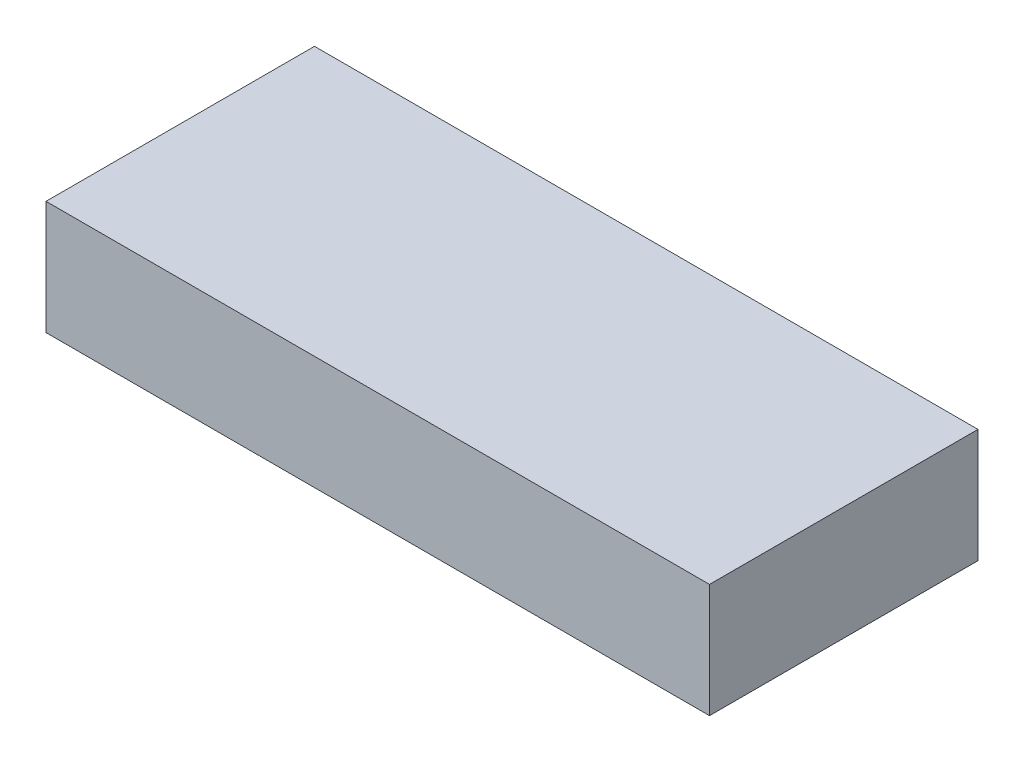
ISO-10303-21;
HEADER;
FILE_DESCRIPTION(('STEP AP214'),'2;1');
FILE_NAME('part.step','',(''),(''),'','','');
FILE_SCHEMA(('AUTOMOTIVE_DESIGN { 1 0 10303 214 1 1 1 1 }'));
ENDSEC;
DATA;
#1=APPLICATION_CONTEXT('core data for automotive mechanical design processes');
#2=APPLICATION_PROTOCOL_DEFINITION('international standard','automotive_design',2000,#1);
#3=PRODUCT_CONTEXT('',#1,'mechanical');
#4=PRODUCT('Part','Part','',(#3));
#5=PRODUCT_RELATED_PRODUCT_CATEGORY('part','',(#4));
#6=PRODUCT_DEFINITION_FORMATION('','',#4);
#7=PRODUCT_DEFINITION_CONTEXT('part definition',#1,'design');
#8=PRODUCT_DEFINITION('design','',#6,#7);
#9=PRODUCT_DEFINITION_SHAPE('','',#8);
#10=(LENGTH_UNIT() NAMED_UNIT(*) SI_UNIT(.MILLI.,.METRE.));
#11=(NAMED_UNIT(*) PLANE_ANGLE_UNIT() SI_UNIT($,.RADIAN.));
#12=(NAMED_UNIT(*) SI_UNIT($,.STERADIAN.) SOLID_ANGLE_UNIT());
#13=UNCERTAINTY_MEASURE_WITH_UNIT(LENGTH_MEASURE(1.E-05),#10,'distance_accuracy_value','');
#14=(GEOMETRIC_REPRESENTATION_CONTEXT(3) GLOBAL_UNCERTAINTY_ASSIGNED_CONTEXT((#13)) GLOBAL_UNIT_ASSIGNED_CONTEXT((#10,
#11,#12)) REPRESENTATION_CONTEXT('',''));
#15=CARTESIAN_POINT('',(0.,0.,0.));
#16=DIRECTION('',(0.,0.,1.));
#17=DIRECTION('',(1.,0.,0.));
#18=AXIS2_PLACEMENT_3D('',#15,#16,#17);
#19=CARTESIAN_POINT('',(-31.075,10.65,12.575));
#20=DIRECTION('',(1.,0.,0.));
#21=DIRECTION('',(0.,0.,-1.));
#22=AXIS2_PLACEMENT_3D('',#19,#20,#21);
#23=PLANE('',#22);
#24=DIRECTION('',(0.,0.,1.));
#25=VECTOR('',#24,1.);
#26=CARTESIAN_POINT('',(-31.075,0.,12.575));
#27=LINE('',#26,#25);
#28=CARTESIAN_POINT('',(-31.075,0.,-12.575));
#29=VERTEX_POINT('',#28);
#30=CARTESIAN_POINT('',(-31.075,0.,12.575));
#31=VERTEX_POINT('',#30);
#32=EDGE_CURVE('E96',#29,#31,#27,.T.);
#33=ORIENTED_EDGE('',*,*,#32,.T.);
#34=DIRECTION('',(0.,-1.,0.));
#35=VECTOR('',#34,1.);
#36=CARTESIAN_POINT('',(-31.075,10.65,12.575));
#37=LINE('',#36,#35);
#38=CARTESIAN_POINT('',(-31.075,10.65,12.575));
#39=VERTEX_POINT('',#38);
#40=EDGE_CURVE('E11',#39,#31,#37,.T.);
#41=ORIENTED_EDGE('',*,*,#40,.F.);
#42=DIRECTION('',(0.,0.,1.));
#43=VECTOR('',#42,1.);
#44=CARTESIAN_POINT('',(-31.075,10.65,12.575));
#45=LINE('',#44,#43);
#46=CARTESIAN_POINT('',(-31.075,10.65,-12.575));
#47=VERTEX_POINT('',#46);
#48=EDGE_CURVE('E84',#47,#39,#45,.T.);
#49=ORIENTED_EDGE('',*,*,#48,.F.);
#50=DIRECTION('',(0.,-1.,0.));
#51=VECTOR('',#50,1.);
#52=CARTESIAN_POINT('',(-31.075,10.65,-12.575));
#53=LINE('',#52,#51);
#54=EDGE_CURVE('E92',#47,#29,#53,.T.);
#55=ORIENTED_EDGE('',*,*,#54,.T.);
#56=EDGE_LOOP('',(#33,#41,#49,#55));
#57=FACE_BOUND('',#56,.T.);
#58=ADVANCED_FACE('F33',(#57),#23,.F.);
#59=CARTESIAN_POINT('',(31.075,10.65,12.575));
#60=DIRECTION('',(0.,0.,-1.));
#61=DIRECTION('',(-1.,0.,0.));
#62=AXIS2_PLACEMENT_3D('',#59,#60,#61);
#63=PLANE('',#62);
#64=DIRECTION('',(1.,0.,0.));
#65=VECTOR('',#64,1.);
#66=CARTESIAN_POINT('',(31.075,0.,12.575));
#67=LINE('',#66,#65);
#68=CARTESIAN_POINT('',(31.075,0.,12.575));
#69=VERTEX_POINT('',#68);
#70=EDGE_CURVE('E88',#31,#69,#67,.T.);
#71=ORIENTED_EDGE('',*,*,#70,.T.);
#72=DIRECTION('',(0.,-1.,0.));
#73=VECTOR('',#72,1.);
#74=CARTESIAN_POINT('',(31.075,10.65,12.575));
#75=LINE('',#74,#73);
#76=CARTESIAN_POINT('',(31.075,10.65,12.575));
#77=VERTEX_POINT('',#76);
#78=EDGE_CURVE('E41',#77,#69,#75,.T.);
#79=ORIENTED_EDGE('',*,*,#78,.F.);
#80=DIRECTION('',(1.,0.,0.));
#81=VECTOR('',#80,1.);
#82=CARTESIAN_POINT('',(31.075,10.65,12.575));
#83=LINE('',#82,#81);
#84=EDGE_CURVE('E79',#39,#77,#83,.T.);
#85=ORIENTED_EDGE('',*,*,#84,.F.);
#86=ORIENTED_EDGE('',*,*,#40,.T.);
#87=EDGE_LOOP('',(#71,#79,#85,#86));
#88=FACE_BOUND('',#87,.T.);
#89=ADVANCED_FACE('F87',(#88),#63,.F.);
#90=CARTESIAN_POINT('',(31.075,10.65,12.575));
#91=DIRECTION('',(-1.,0.,0.));
#92=DIRECTION('',(0.,0.,1.));
#93=AXIS2_PLACEMENT_3D('',#90,#91,#92);
#94=PLANE('',#93);
#95=DIRECTION('',(0.,0.,-1.));
#96=VECTOR('',#95,1.);
#97=CARTESIAN_POINT('',(31.075,0.,12.575));
#98=LINE('',#97,#96);
#99=CARTESIAN_POINT('',(31.075,0.,-12.575));
#100=VERTEX_POINT('',#99);
#101=EDGE_CURVE('E66',#69,#100,#98,.T.);
#102=ORIENTED_EDGE('',*,*,#101,.T.);
#103=DIRECTION('',(0.,-1.,0.));
#104=VECTOR('',#103,1.);
#105=CARTESIAN_POINT('',(31.075,10.65,-12.575));
#106=LINE('',#105,#104);
#107=CARTESIAN_POINT('',(31.075,10.65,-12.575));
#108=VERTEX_POINT('',#107);
#109=EDGE_CURVE('E89',#108,#100,#106,.T.);
#110=ORIENTED_EDGE('',*,*,#109,.F.);
#111=DIRECTION('',(0.,0.,-1.));
#112=VECTOR('',#111,1.);
#113=CARTESIAN_POINT('',(31.075,10.65,12.575));
#114=LINE('',#113,#112);
#115=EDGE_CURVE('E82',#77,#108,#114,.T.);
#116=ORIENTED_EDGE('',*,*,#115,.F.);
#117=ORIENTED_EDGE('',*,*,#78,.T.);
#118=EDGE_LOOP('',(#102,#110,#116,#117));
#119=FACE_BOUND('',#118,.T.);
#120=ADVANCED_FACE('F90',(#119),#94,.F.);
#121=CARTESIAN_POINT('',(31.075,10.65,-12.575));
#122=DIRECTION('',(0.,0.,1.));
#123=DIRECTION('',(1.,0.,0.));
#124=AXIS2_PLACEMENT_3D('',#121,#122,#123);
#125=PLANE('',#124);
#126=DIRECTION('',(-1.,0.,0.));
#127=VECTOR('',#126,1.);
#128=CARTESIAN_POINT('',(31.075,0.,-12.575));
#129=LINE('',#128,#127);
#130=EDGE_CURVE('E72',#100,#29,#129,.T.);
#131=ORIENTED_EDGE('',*,*,#130,.T.);
#132=ORIENTED_EDGE('',*,*,#54,.F.);
#133=DIRECTION('',(-1.,0.,0.));
#134=VECTOR('',#133,1.);
#135=CARTESIAN_POINT('',(31.075,10.65,-12.575));
#136=LINE('',#135,#134);
#137=EDGE_CURVE('E49',#108,#47,#136,.T.);
#138=ORIENTED_EDGE('',*,*,#137,.F.);
#139=ORIENTED_EDGE('',*,*,#109,.T.);
#140=EDGE_LOOP('',(#131,#132,#138,#139));
#141=FACE_BOUND('',#140,.T.);
#142=ADVANCED_FACE('F103',(#141),#125,.F.);
#143=CARTESIAN_POINT('',(0.,10.65,0.));
#144=DIRECTION('',(0.,1.,0.));
#145=DIRECTION('',(0.,0.,1.));
#146=AXIS2_PLACEMENT_3D('',#143,#144,#145);
#147=PLANE('',#146);
#148=ORIENTED_EDGE('',*,*,#48,.T.);
#149=ORIENTED_EDGE('',*,*,#84,.T.);
#150=ORIENTED_EDGE('',*,*,#115,.T.);
#151=ORIENTED_EDGE('',*,*,#137,.T.);
#152=EDGE_LOOP('',(#148,#149,#150,#151));
#153=FACE_BOUND('',#152,.T.);
#154=ADVANCED_FACE('F80',(#153),#147,.T.);
#155=CARTESIAN_POINT('',(0.,0.,0.));
#156=DIRECTION('',(0.,1.,0.));
#157=DIRECTION('',(0.,0.,1.));
#158=AXIS2_PLACEMENT_3D('',#155,#156,#157);
#159=PLANE('',#158);
#160=ORIENTED_EDGE('',*,*,#32,.F.);
#161=ORIENTED_EDGE('',*,*,#130,.F.);
#162=ORIENTED_EDGE('',*,*,#101,.F.);
#163=ORIENTED_EDGE('',*,*,#70,.F.);
#164=EDGE_LOOP('',(#160,#161,#162,#163));
#165=FACE_BOUND('',#164,.T.);
#166=ADVANCED_FACE('F106',(#165),#159,.F.);
#167=CLOSED_SHELL('',(#58,#89,#120,#142,#154,#166));
#168=MANIFOLD_SOLID_BREP('B2',#167);
#169=ADVANCED_BREP_SHAPE_REPRESENTATION('',(#18,#168),#14);
#170=SHAPE_DEFINITION_REPRESENTATION(#9,#169);
ENDSEC;
END-ISO-10303-21;
